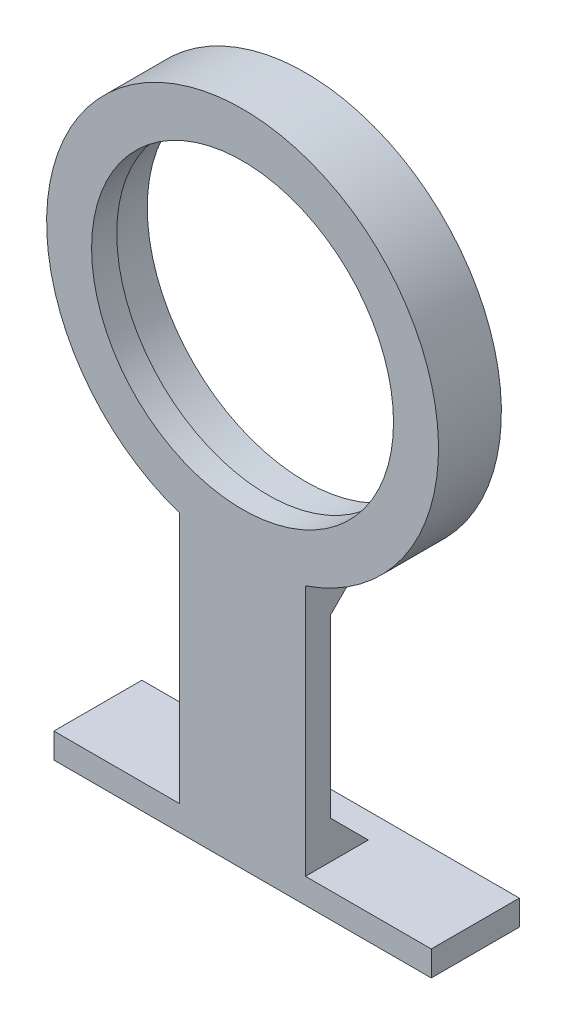
ISO-10303-21;
HEADER;
FILE_DESCRIPTION(('STEP AP214'),'2;1');
FILE_NAME('part.step','',(''),(''),'','','');
FILE_SCHEMA(('AUTOMOTIVE_DESIGN { 1 0 10303 214 1 1 1 1 }'));
ENDSEC;
DATA;
#1=APPLICATION_CONTEXT('core data for automotive mechanical design processes');
#2=APPLICATION_PROTOCOL_DEFINITION('international standard','automotive_design',2000,#1);
#3=PRODUCT_CONTEXT('',#1,'mechanical');
#4=PRODUCT('Part','Part','',(#3));
#5=PRODUCT_RELATED_PRODUCT_CATEGORY('part','',(#4));
#6=PRODUCT_DEFINITION_FORMATION('','',#4);
#7=PRODUCT_DEFINITION_CONTEXT('part definition',#1,'design');
#8=PRODUCT_DEFINITION('design','',#6,#7);
#9=PRODUCT_DEFINITION_SHAPE('','',#8);
#10=(LENGTH_UNIT() NAMED_UNIT(*) SI_UNIT(.MILLI.,.METRE.));
#11=(NAMED_UNIT(*) PLANE_ANGLE_UNIT() SI_UNIT($,.RADIAN.));
#12=(NAMED_UNIT(*) SI_UNIT($,.STERADIAN.) SOLID_ANGLE_UNIT());
#13=UNCERTAINTY_MEASURE_WITH_UNIT(LENGTH_MEASURE(1.E-05),#10,'distance_accuracy_value','');
#14=(GEOMETRIC_REPRESENTATION_CONTEXT(3) GLOBAL_UNCERTAINTY_ASSIGNED_CONTEXT((#13)) GLOBAL_UNIT_ASSIGNED_CONTEXT((#10,
#11,#12)) REPRESENTATION_CONTEXT('',''));
#15=CARTESIAN_POINT('',(0.,0.,0.));
#16=DIRECTION('',(0.,0.,1.));
#17=DIRECTION('',(1.,0.,0.));
#18=AXIS2_PLACEMENT_3D('',#15,#16,#17);
#19=CARTESIAN_POINT('',(0.,0.,-1.));
#20=DIRECTION('',(0.,0.,1.));
#21=DIRECTION('',(1.,0.,0.));
#22=AXIS2_PLACEMENT_3D('',#19,#20,#21);
#23=PLANE('',#22);
#24=CARTESIAN_POINT('',(0.,0.,-1.));
#25=DIRECTION('',(0.,0.,1.));
#26=DIRECTION('',(1.,0.,0.));
#27=AXIS2_PLACEMENT_3D('',#24,#25,#26);
#28=CIRCLE('',#27,12.575);
#29=CARTESIAN_POINT('',(12.575,0.,-1.));
#30=VERTEX_POINT('',#29);
#31=EDGE_CURVE('E189',#30,#30,#28,.T.);
#32=ORIENTED_EDGE('',*,*,#31,.T.);
#33=EDGE_LOOP('',(#32));
#34=FACE_BOUND('',#33,.T.);
#35=CARTESIAN_POINT('',(0.,0.,-1.));
#36=DIRECTION('',(0.,0.,1.));
#37=DIRECTION('',(1.,0.,0.));
#38=AXIS2_PLACEMENT_3D('',#35,#36,#37);
#39=CIRCLE('',#38,15.575);
#40=CARTESIAN_POINT('',(5.,-14.7506143939837,-1.));
#41=VERTEX_POINT('',#40);
#42=CARTESIAN_POINT('',(-5.,-14.7506143939837,-1.));
#43=VERTEX_POINT('',#42);
#44=EDGE_CURVE('E192',#41,#43,#39,.T.);
#45=ORIENTED_EDGE('',*,*,#44,.F.);
#46=DIRECTION('',(-1.,0.,0.));
#47=VECTOR('',#46,1.);
#48=CARTESIAN_POINT('',(0.,-14.7506143939837,-1.));
#49=LINE('',#48,#47);
#50=EDGE_CURVE('E11',#41,#43,#49,.T.);
#51=ORIENTED_EDGE('',*,*,#50,.T.);
#52=EDGE_LOOP('',(#45,#51));
#53=FACE_BOUND('',#52,.T.);
#54=ADVANCED_FACE('F33',(#34,#53),#23,.F.);
#55=CARTESIAN_POINT('',(0.,0.,-1.));
#56=DIRECTION('',(0.,0.,1.));
#57=DIRECTION('',(1.,0.,0.));
#58=AXIS2_PLACEMENT_3D('',#55,#56,#57);
#59=CYLINDRICAL_SURFACE('',#58,15.575);
#60=DIRECTION('',(0.,0.,1.));
#61=VECTOR('',#60,1.);
#62=CARTESIAN_POINT('',(-5.,-14.7506143939837,-1.));
#63=LINE('',#62,#61);
#64=CARTESIAN_POINT('',(-5.00000000000002,-14.7506143939837,4.));
#65=VERTEX_POINT('',#64);
#66=EDGE_CURVE('E195',#43,#65,#63,.T.);
#67=ORIENTED_EDGE('',*,*,#66,.T.);
#68=CARTESIAN_POINT('',(0.,0.,4.));
#69=DIRECTION('',(0.,0.,1.));
#70=DIRECTION('',(1.,0.,0.));
#71=AXIS2_PLACEMENT_3D('',#68,#69,#70);
#72=CIRCLE('',#71,15.575);
#73=CARTESIAN_POINT('',(5.,-14.7506143939837,4.));
#74=VERTEX_POINT('',#73);
#75=EDGE_CURVE('E165',#74,#65,#72,.T.);
#76=ORIENTED_EDGE('',*,*,#75,.F.);
#77=DIRECTION('',(0.,0.,1.));
#78=VECTOR('',#77,1.);
#79=CARTESIAN_POINT('',(5.,-14.7506143939837,-1.));
#80=LINE('',#79,#78);
#81=EDGE_CURVE('E48',#41,#74,#80,.T.);
#82=ORIENTED_EDGE('',*,*,#81,.F.);
#83=ORIENTED_EDGE('',*,*,#44,.T.);
#84=EDGE_LOOP('',(#67,#76,#82,#83));
#85=FACE_BOUND('',#84,.T.);
#86=ADVANCED_FACE('F35',(#85),#59,.T.);
#87=CARTESIAN_POINT('',(5.,-14.7506143939837,-1.));
#88=DIRECTION('',(1.,0.,0.));
#89=DIRECTION('',(0.,1.,0.));
#90=AXIS2_PLACEMENT_3D('',#87,#88,#89);
#91=PLANE('',#90);
#92=DIRECTION('',(0.,-0.707106781186546,0.707106781186549));
#93=VECTOR('',#92,1.);
#94=CARTESIAN_POINT('',(5.,-14.7506143939837,-1.));
#95=LINE('',#94,#93);
#96=CARTESIAN_POINT('',(5.,-17.7506143939837,2.));
#97=VERTEX_POINT('',#96);
#98=EDGE_CURVE('E157',#41,#97,#95,.T.);
#99=ORIENTED_EDGE('',*,*,#98,.F.);
#100=ORIENTED_EDGE('',*,*,#81,.T.);
#101=DIRECTION('',(0.,1.,0.));
#102=VECTOR('',#101,1.);
#103=CARTESIAN_POINT('',(5.,-34.7506143939837,4.));
#104=LINE('',#103,#102);
#105=CARTESIAN_POINT('',(5.,-34.7506143939837,4.));
#106=VERTEX_POINT('',#105);
#107=EDGE_CURVE('E184',#106,#74,#104,.T.);
#108=ORIENTED_EDGE('',*,*,#107,.F.);
#109=DIRECTION('',(0.,0.,1.));
#110=VECTOR('',#109,1.);
#111=CARTESIAN_POINT('',(5.,-34.7506143939837,-1.));
#112=LINE('',#111,#110);
#113=CARTESIAN_POINT('',(5.,-34.7506143939837,-1.));
#114=VERTEX_POINT('',#113);
#115=EDGE_CURVE('E56',#114,#106,#112,.T.);
#116=ORIENTED_EDGE('',*,*,#115,.F.);
#117=DIRECTION('',(0.,-0.707106781186546,-0.707106781186549));
#118=VECTOR('',#117,1.);
#119=CARTESIAN_POINT('',(5.,-24.7506143939838,9.));
#120=LINE('',#119,#118);
#121=CARTESIAN_POINT('',(5.,-31.7506143939837,2.));
#122=VERTEX_POINT('',#121);
#123=EDGE_CURVE('E153',#122,#114,#120,.T.);
#124=ORIENTED_EDGE('',*,*,#123,.F.);
#125=DIRECTION('',(0.,-1.,0.));
#126=VECTOR('',#125,1.);
#127=CARTESIAN_POINT('',(5.,-14.7506143939837,2.));
#128=LINE('',#127,#126);
#129=EDGE_CURVE('E159',#97,#122,#128,.T.);
#130=ORIENTED_EDGE('',*,*,#129,.F.);
#131=EDGE_LOOP('',(#99,#100,#108,#116,#124,#130));
#132=FACE_BOUND('',#131,.T.);
#133=ADVANCED_FACE('F219',(#132),#91,.T.);
#134=CARTESIAN_POINT('',(5.,-34.7506143939837,-1.));
#135=DIRECTION('',(0.,1.,0.));
#136=DIRECTION('',(0.,0.,1.));
#137=AXIS2_PLACEMENT_3D('',#134,#135,#136);
#138=PLANE('',#137);
#139=ORIENTED_EDGE('',*,*,#115,.T.);
#140=DIRECTION('',(-1.,0.,0.));
#141=VECTOR('',#140,1.);
#142=CARTESIAN_POINT('',(15.,-34.7506143939837,4.));
#143=LINE('',#142,#141);
#144=CARTESIAN_POINT('',(15.,-34.7506143939837,4.));
#145=VERTEX_POINT('',#144);
#146=EDGE_CURVE('E182',#145,#106,#143,.T.);
#147=ORIENTED_EDGE('',*,*,#146,.F.);
#148=DIRECTION('',(0.,0.,1.));
#149=VECTOR('',#148,1.);
#150=CARTESIAN_POINT('',(15.,-34.7506143939837,-1.));
#151=LINE('',#150,#149);
#152=CARTESIAN_POINT('',(15.,-34.7506143939837,-3.));
#153=VERTEX_POINT('',#152);
#154=EDGE_CURVE('E128',#153,#145,#151,.T.);
#155=ORIENTED_EDGE('',*,*,#154,.F.);
#156=DIRECTION('',(1.,0.,0.));
#157=VECTOR('',#156,1.);
#158=CARTESIAN_POINT('',(-15.,-34.7506143939837,-3.));
#159=LINE('',#158,#157);
#160=CARTESIAN_POINT('',(-15.,-34.7506143939837,-3.));
#161=VERTEX_POINT('',#160);
#162=EDGE_CURVE('E126',#161,#153,#159,.T.);
#163=ORIENTED_EDGE('',*,*,#162,.F.);
#164=DIRECTION('',(0.,0.,1.));
#165=VECTOR('',#164,1.);
#166=CARTESIAN_POINT('',(-15.,-34.7506143939837,-1.));
#167=LINE('',#166,#165);
#168=CARTESIAN_POINT('',(-15.,-34.7506143939837,4.));
#169=VERTEX_POINT('',#168);
#170=EDGE_CURVE('E113',#161,#169,#167,.T.);
#171=ORIENTED_EDGE('',*,*,#170,.T.);
#172=DIRECTION('',(-1.,0.,0.));
#173=VECTOR('',#172,1.);
#174=CARTESIAN_POINT('',(-5.,-34.7506143939837,4.));
#175=LINE('',#174,#173);
#176=CARTESIAN_POINT('',(-5.,-34.7506143939837,4.));
#177=VERTEX_POINT('',#176);
#178=EDGE_CURVE('E173',#177,#169,#175,.T.);
#179=ORIENTED_EDGE('',*,*,#178,.F.);
#180=DIRECTION('',(0.,0.,1.));
#181=VECTOR('',#180,1.);
#182=CARTESIAN_POINT('',(-5.,-34.7506143939837,-1.));
#183=LINE('',#182,#181);
#184=CARTESIAN_POINT('',(-5.,-34.7506143939837,-1.));
#185=VERTEX_POINT('',#184);
#186=EDGE_CURVE('E123',#185,#177,#183,.T.);
#187=ORIENTED_EDGE('',*,*,#186,.F.);
#188=DIRECTION('',(1.,0.,0.));
#189=VECTOR('',#188,1.);
#190=CARTESIAN_POINT('',(0.,-34.7506143939837,-1.));
#191=LINE('',#190,#189);
#192=EDGE_CURVE('E41',#185,#114,#191,.T.);
#193=ORIENTED_EDGE('',*,*,#192,.T.);
#194=EDGE_LOOP('',(#139,#147,#155,#163,#171,#179,#187,#193));
#195=FACE_BOUND('',#194,.T.);
#196=ADVANCED_FACE('F127',(#195),#138,.T.);
#197=CARTESIAN_POINT('',(15.,-34.7506143939837,-1.));
#198=DIRECTION('',(1.,0.,0.));
#199=DIRECTION('',(0.,1.,0.));
#200=AXIS2_PLACEMENT_3D('',#197,#198,#199);
#201=PLANE('',#200);
#202=ORIENTED_EDGE('',*,*,#154,.T.);
#203=DIRECTION('',(0.,1.,0.));
#204=VECTOR('',#203,1.);
#205=CARTESIAN_POINT('',(15.,-36.7506143939837,4.));
#206=LINE('',#205,#204);
#207=CARTESIAN_POINT('',(15.,-36.7506143939837,4.));
#208=VERTEX_POINT('',#207);
#209=EDGE_CURVE('E179',#208,#145,#206,.T.);
#210=ORIENTED_EDGE('',*,*,#209,.F.);
#211=DIRECTION('',(0.,0.,1.));
#212=VECTOR('',#211,1.);
#213=CARTESIAN_POINT('',(15.,-36.7506143939837,-1.));
#214=LINE('',#213,#212);
#215=CARTESIAN_POINT('',(15.,-36.7506143939837,-3.));
#216=VERTEX_POINT('',#215);
#217=EDGE_CURVE('E199',#216,#208,#214,.T.);
#218=ORIENTED_EDGE('',*,*,#217,.F.);
#219=DIRECTION('',(0.,-1.,0.));
#220=VECTOR('',#219,1.);
#221=CARTESIAN_POINT('',(15.,-34.7506143939837,-3.));
#222=LINE('',#221,#220);
#223=EDGE_CURVE('E132',#153,#216,#222,.T.);
#224=ORIENTED_EDGE('',*,*,#223,.F.);
#225=EDGE_LOOP('',(#202,#210,#218,#224));
#226=FACE_BOUND('',#225,.T.);
#227=ADVANCED_FACE('F231',(#226),#201,.T.);
#228=CARTESIAN_POINT('',(-15.,-36.7506143939837,-1.));
#229=DIRECTION('',(0.,-1.,0.));
#230=DIRECTION('',(0.,0.,-1.));
#231=AXIS2_PLACEMENT_3D('',#228,#229,#230);
#232=PLANE('',#231);
#233=ORIENTED_EDGE('',*,*,#217,.T.);
#234=DIRECTION('',(1.,0.,0.));
#235=VECTOR('',#234,1.);
#236=CARTESIAN_POINT('',(-15.,-36.7506143939837,4.));
#237=LINE('',#236,#235);
#238=CARTESIAN_POINT('',(-15.,-36.7506143939837,4.));
#239=VERTEX_POINT('',#238);
#240=EDGE_CURVE('E176',#239,#208,#237,.T.);
#241=ORIENTED_EDGE('',*,*,#240,.F.);
#242=DIRECTION('',(0.,0.,1.));
#243=VECTOR('',#242,1.);
#244=CARTESIAN_POINT('',(-15.,-36.7506143939837,-1.));
#245=LINE('',#244,#243);
#246=CARTESIAN_POINT('',(-15.,-36.7506143939837,-3.));
#247=VERTEX_POINT('',#246);
#248=EDGE_CURVE('E122',#247,#239,#245,.T.);
#249=ORIENTED_EDGE('',*,*,#248,.F.);
#250=DIRECTION('',(-1.,0.,0.));
#251=VECTOR('',#250,1.);
#252=CARTESIAN_POINT('',(15.,-36.7506143939837,-3.));
#253=LINE('',#252,#251);
#254=EDGE_CURVE('E137',#216,#247,#253,.T.);
#255=ORIENTED_EDGE('',*,*,#254,.F.);
#256=EDGE_LOOP('',(#233,#241,#249,#255));
#257=FACE_BOUND('',#256,.T.);
#258=ADVANCED_FACE('F229',(#257),#232,.T.);
#259=CARTESIAN_POINT('',(-15.,-34.7506143939837,-1.));
#260=DIRECTION('',(-1.,0.,0.));
#261=DIRECTION('',(0.,-1.,0.));
#262=AXIS2_PLACEMENT_3D('',#259,#260,#261);
#263=PLANE('',#262);
#264=ORIENTED_EDGE('',*,*,#248,.T.);
#265=DIRECTION('',(0.,-1.,0.));
#266=VECTOR('',#265,1.);
#267=CARTESIAN_POINT('',(-15.,-34.7506143939837,4.));
#268=LINE('',#267,#266);
#269=EDGE_CURVE('E119',#169,#239,#268,.T.);
#270=ORIENTED_EDGE('',*,*,#269,.F.);
#271=ORIENTED_EDGE('',*,*,#170,.F.);
#272=DIRECTION('',(0.,1.,0.));
#273=VECTOR('',#272,1.);
#274=CARTESIAN_POINT('',(-15.,-36.7506143939837,-3.));
#275=LINE('',#274,#273);
#276=EDGE_CURVE('E117',#247,#161,#275,.T.);
#277=ORIENTED_EDGE('',*,*,#276,.F.);
#278=EDGE_LOOP('',(#264,#270,#271,#277));
#279=FACE_BOUND('',#278,.T.);
#280=ADVANCED_FACE('F115',(#279),#263,.T.);
#281=CARTESIAN_POINT('',(-5.,-14.7506143939837,-1.));
#282=DIRECTION('',(-1.,0.,0.));
#283=DIRECTION('',(0.,-1.,0.));
#284=AXIS2_PLACEMENT_3D('',#281,#282,#283);
#285=PLANE('',#284);
#286=DIRECTION('',(0.,0.707106781186546,-0.707106781186549));
#287=VECTOR('',#286,1.);
#288=CARTESIAN_POINT('',(-5.,-14.7506143939837,-1.));
#289=LINE('',#288,#287);
#290=CARTESIAN_POINT('',(-5.,-17.7506143939837,2.));
#291=VERTEX_POINT('',#290);
#292=EDGE_CURVE('E148',#291,#43,#289,.T.);
#293=ORIENTED_EDGE('',*,*,#292,.F.);
#294=DIRECTION('',(0.,1.,0.));
#295=VECTOR('',#294,1.);
#296=CARTESIAN_POINT('',(-5.,-17.7506143939837,2.));
#297=LINE('',#296,#295);
#298=CARTESIAN_POINT('',(-5.,-31.7506143939837,2.));
#299=VERTEX_POINT('',#298);
#300=EDGE_CURVE('E145',#299,#291,#297,.T.);
#301=ORIENTED_EDGE('',*,*,#300,.F.);
#302=DIRECTION('',(0.,0.707106781186546,0.707106781186549));
#303=VECTOR('',#302,1.);
#304=CARTESIAN_POINT('',(-5.,-31.7506143939837,2.));
#305=LINE('',#304,#303);
#306=EDGE_CURVE('E142',#185,#299,#305,.T.);
#307=ORIENTED_EDGE('',*,*,#306,.F.);
#308=ORIENTED_EDGE('',*,*,#186,.T.);
#309=DIRECTION('',(0.,-1.,0.));
#310=VECTOR('',#309,1.);
#311=CARTESIAN_POINT('',(-5.00000000000002,-14.7506143939837,4.));
#312=LINE('',#311,#310);
#313=EDGE_CURVE('E170',#65,#177,#312,.T.);
#314=ORIENTED_EDGE('',*,*,#313,.F.);
#315=ORIENTED_EDGE('',*,*,#66,.F.);
#316=EDGE_LOOP('',(#293,#301,#307,#308,#314,#315));
#317=FACE_BOUND('',#316,.T.);
#318=ADVANCED_FACE('F212',(#317),#285,.T.);
#319=CARTESIAN_POINT('',(0.,0.,-1.));
#320=DIRECTION('',(0.,0.,1.));
#321=DIRECTION('',(1.,0.,0.));
#322=AXIS2_PLACEMENT_3D('',#319,#320,#321);
#323=CYLINDRICAL_SURFACE('',#322,12.575);
#324=ORIENTED_EDGE('',*,*,#31,.F.);
#325=EDGE_LOOP('',(#324));
#326=FACE_BOUND('',#325,.T.);
#327=CARTESIAN_POINT('',(0.,0.,2.));
#328=DIRECTION('',(0.,0.,1.));
#329=DIRECTION('',(1.,0.,0.));
#330=AXIS2_PLACEMENT_3D('',#327,#328,#329);
#331=CIRCLE('',#330,12.575);
#332=CARTESIAN_POINT('',(12.575,0.,2.));
#333=VERTEX_POINT('',#332);
#334=EDGE_CURVE('E186',#333,#333,#331,.F.);
#335=ORIENTED_EDGE('',*,*,#334,.F.);
#336=EDGE_LOOP('',(#335));
#337=FACE_BOUND('',#336,.T.);
#338=ADVANCED_FACE('F249',(#326,#337),#323,.F.);
#339=CARTESIAN_POINT('',(0.,0.,2.));
#340=DIRECTION('',(0.,0.,1.));
#341=DIRECTION('',(1.,0.,0.));
#342=AXIS2_PLACEMENT_3D('',#339,#340,#341);
#343=PLANE('',#342);
#344=CARTESIAN_POINT('',(0.,0.,2.));
#345=DIRECTION('',(0.,0.,1.));
#346=DIRECTION('',(1.,0.,0.));
#347=AXIS2_PLACEMENT_3D('',#344,#345,#346);
#348=CIRCLE('',#347,12.);
#349=CARTESIAN_POINT('',(12.,0.,2.));
#350=VERTEX_POINT('',#349);
#351=EDGE_CURVE('E161',#350,#350,#348,.T.);
#352=ORIENTED_EDGE('',*,*,#351,.T.);
#353=EDGE_LOOP('',(#352));
#354=FACE_BOUND('',#353,.T.);
#355=ORIENTED_EDGE('',*,*,#334,.T.);
#356=EDGE_LOOP('',(#355));
#357=FACE_BOUND('',#356,.T.);
#358=ADVANCED_FACE('F329',(#354,#357),#343,.F.);
#359=CARTESIAN_POINT('',(0.,0.,4.));
#360=DIRECTION('',(0.,0.,1.));
#361=DIRECTION('',(1.,0.,0.));
#362=AXIS2_PLACEMENT_3D('',#359,#360,#361);
#363=PLANE('',#362);
#364=ORIENTED_EDGE('',*,*,#75,.T.);
#365=ORIENTED_EDGE('',*,*,#313,.T.);
#366=ORIENTED_EDGE('',*,*,#178,.T.);
#367=ORIENTED_EDGE('',*,*,#269,.T.);
#368=ORIENTED_EDGE('',*,*,#240,.T.);
#369=ORIENTED_EDGE('',*,*,#209,.T.);
#370=ORIENTED_EDGE('',*,*,#146,.T.);
#371=ORIENTED_EDGE('',*,*,#107,.T.);
#372=EDGE_LOOP('',(#364,#365,#366,#367,#368,#369,#370,#371));
#373=FACE_BOUND('',#372,.T.);
#374=CARTESIAN_POINT('',(0.,0.,4.));
#375=DIRECTION('',(0.,0.,1.));
#376=DIRECTION('',(1.,0.,0.));
#377=AXIS2_PLACEMENT_3D('',#374,#375,#376);
#378=CIRCLE('',#377,12.);
#379=CARTESIAN_POINT('',(12.,0.,4.));
#380=VERTEX_POINT('',#379);
#381=EDGE_CURVE('E162',#380,#380,#378,.T.);
#382=ORIENTED_EDGE('',*,*,#381,.F.);
#383=EDGE_LOOP('',(#382));
#384=FACE_BOUND('',#383,.T.);
#385=ADVANCED_FACE('F222',(#373,#384),#363,.T.);
#386=CARTESIAN_POINT('',(0.,0.,4.));
#387=DIRECTION('',(0.,0.,-1.));
#388=DIRECTION('',(-1.,0.,0.));
#389=AXIS2_PLACEMENT_3D('',#386,#387,#388);
#390=CYLINDRICAL_SURFACE('',#389,12.);
#391=ORIENTED_EDGE('',*,*,#381,.T.);
#392=EDGE_LOOP('',(#391));
#393=FACE_BOUND('',#392,.T.);
#394=ORIENTED_EDGE('',*,*,#351,.F.);
#395=EDGE_LOOP('',(#394));
#396=FACE_BOUND('',#395,.T.);
#397=ADVANCED_FACE('F322',(#393,#396),#390,.F.);
#398=CARTESIAN_POINT('',(15.575,-14.7506143939837,-1.));
#399=DIRECTION('',(0.,0.707106781186549,0.707106781186546));
#400=DIRECTION('',(0.,-0.707106781186546,0.707106781186549));
#401=AXIS2_PLACEMENT_3D('',#398,#399,#400);
#402=PLANE('',#401);
#403=ORIENTED_EDGE('',*,*,#98,.T.);
#404=DIRECTION('',(-1.,0.,0.));
#405=VECTOR('',#404,1.);
#406=CARTESIAN_POINT('',(15.575,-17.7506143939837,2.));
#407=LINE('',#406,#405);
#408=EDGE_CURVE('E151',#97,#291,#407,.T.);
#409=ORIENTED_EDGE('',*,*,#408,.T.);
#410=ORIENTED_EDGE('',*,*,#292,.T.);
#411=ORIENTED_EDGE('',*,*,#50,.F.);
#412=EDGE_LOOP('',(#403,#409,#410,#411));
#413=FACE_BOUND('',#412,.T.);
#414=ADVANCED_FACE('F319',(#413),#402,.F.);
#415=CARTESIAN_POINT('',(15.575,-17.7506143939837,2.));
#416=DIRECTION('',(0.,0.,1.));
#417=DIRECTION('',(0.,-1.,0.));
#418=AXIS2_PLACEMENT_3D('',#415,#416,#417);
#419=PLANE('',#418);
#420=ORIENTED_EDGE('',*,*,#129,.T.);
#421=DIRECTION('',(-1.,0.,0.));
#422=VECTOR('',#421,1.);
#423=CARTESIAN_POINT('',(15.575,-31.7506143939837,2.));
#424=LINE('',#423,#422);
#425=EDGE_CURVE('E150',#122,#299,#424,.T.);
#426=ORIENTED_EDGE('',*,*,#425,.T.);
#427=ORIENTED_EDGE('',*,*,#300,.T.);
#428=ORIENTED_EDGE('',*,*,#408,.F.);
#429=EDGE_LOOP('',(#420,#426,#427,#428));
#430=FACE_BOUND('',#429,.T.);
#431=ADVANCED_FACE('F217',(#430),#419,.F.);
#432=CARTESIAN_POINT('',(15.575,-31.7506143939837,2.));
#433=DIRECTION('',(0.,-0.707106781186549,0.707106781186546));
#434=DIRECTION('',(0.,-0.707106781186546,-0.707106781186549));
#435=AXIS2_PLACEMENT_3D('',#432,#433,#434);
#436=PLANE('',#435);
#437=ORIENTED_EDGE('',*,*,#123,.T.);
#438=ORIENTED_EDGE('',*,*,#192,.F.);
#439=ORIENTED_EDGE('',*,*,#306,.T.);
#440=ORIENTED_EDGE('',*,*,#425,.F.);
#441=EDGE_LOOP('',(#437,#438,#439,#440));
#442=FACE_BOUND('',#441,.T.);
#443=ADVANCED_FACE('F206',(#442),#436,.F.);
#444=CARTESIAN_POINT('',(0.,0.,-3.));
#445=DIRECTION('',(0.,0.,-1.));
#446=DIRECTION('',(-1.,0.,0.));
#447=AXIS2_PLACEMENT_3D('',#444,#445,#446);
#448=PLANE('',#447);
#449=ORIENTED_EDGE('',*,*,#276,.T.);
#450=ORIENTED_EDGE('',*,*,#162,.T.);
#451=ORIENTED_EDGE('',*,*,#223,.T.);
#452=ORIENTED_EDGE('',*,*,#254,.T.);
#453=EDGE_LOOP('',(#449,#450,#451,#452));
#454=FACE_BOUND('',#453,.T.);
#455=ADVANCED_FACE('F135',(#454),#448,.T.);
#456=CLOSED_SHELL('',(#54,#86,#133,#196,#227,#258,#280,#318,#338,#358,#385,#397,#414,#431,#443,#455));
#457=MANIFOLD_SOLID_BREP('B2',#456);
#458=ADVANCED_BREP_SHAPE_REPRESENTATION('',(#18,#457),#14);
#459=SHAPE_DEFINITION_REPRESENTATION(#9,#458);
ENDSEC;
END-ISO-10303-21;
